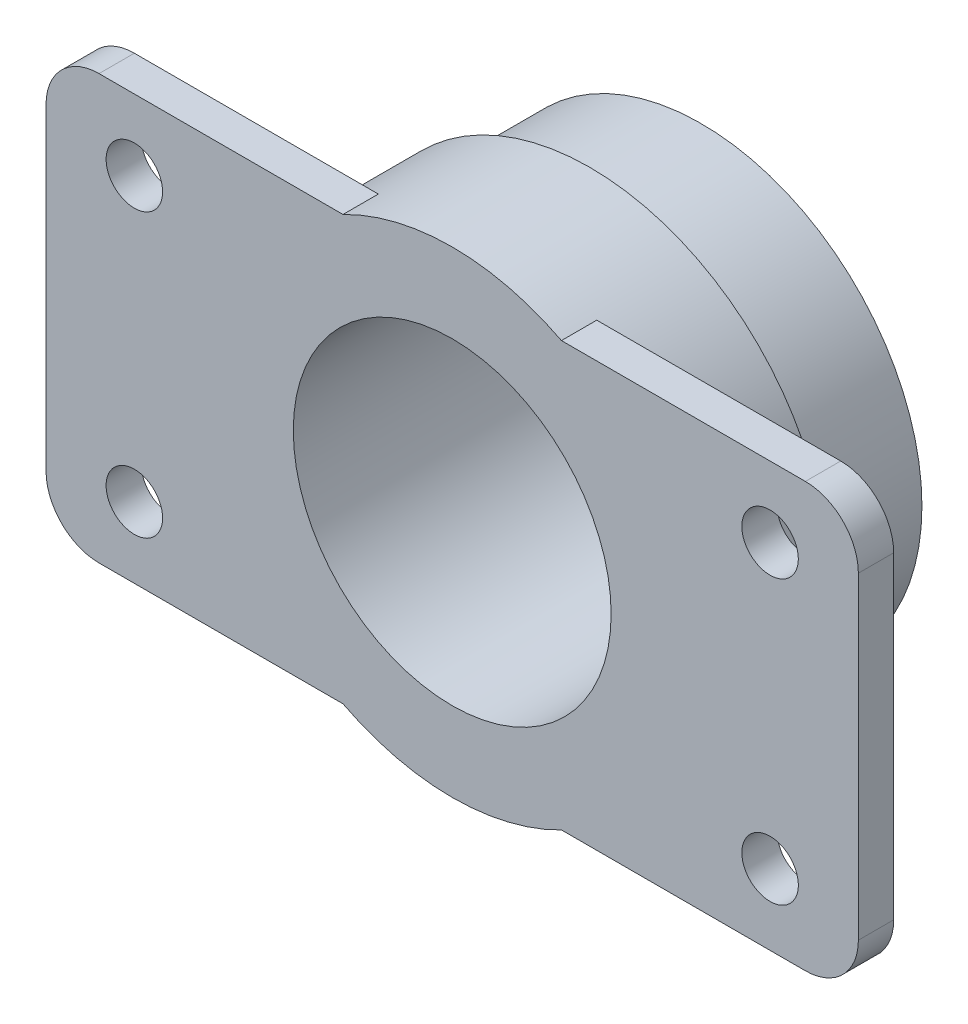
ISO-10303-21;
HEADER;
FILE_DESCRIPTION(('STEP AP214'),'2;1');
FILE_NAME('part.step','',(''),(''),'','','');
FILE_SCHEMA(('AUTOMOTIVE_DESIGN { 1 0 10303 214 1 1 1 1 }'));
ENDSEC;
DATA;
#1=APPLICATION_CONTEXT('core data for automotive mechanical design processes');
#2=APPLICATION_PROTOCOL_DEFINITION('international standard','automotive_design',2000,#1);
#3=PRODUCT_CONTEXT('',#1,'mechanical');
#4=PRODUCT('Part','Part','',(#3));
#5=PRODUCT_RELATED_PRODUCT_CATEGORY('part','',(#4));
#6=PRODUCT_DEFINITION_FORMATION('','',#4);
#7=PRODUCT_DEFINITION_CONTEXT('part definition',#1,'design');
#8=PRODUCT_DEFINITION('design','',#6,#7);
#9=PRODUCT_DEFINITION_SHAPE('','',#8);
#10=(LENGTH_UNIT() NAMED_UNIT(*) SI_UNIT(.MILLI.,.METRE.));
#11=(NAMED_UNIT(*) PLANE_ANGLE_UNIT() SI_UNIT($,.RADIAN.));
#12=(NAMED_UNIT(*) SI_UNIT($,.STERADIAN.) SOLID_ANGLE_UNIT());
#13=UNCERTAINTY_MEASURE_WITH_UNIT(LENGTH_MEASURE(1.E-05),#10,'distance_accuracy_value','');
#14=(GEOMETRIC_REPRESENTATION_CONTEXT(3) GLOBAL_UNCERTAINTY_ASSIGNED_CONTEXT((#13)) GLOBAL_UNIT_ASSIGNED_CONTEXT((#10,
#11,#12)) REPRESENTATION_CONTEXT('',''));
#15=CARTESIAN_POINT('',(0.,0.,0.));
#16=DIRECTION('',(0.,0.,1.));
#17=DIRECTION('',(1.,0.,0.));
#18=AXIS2_PLACEMENT_3D('',#15,#16,#17);
#19=CARTESIAN_POINT('',(23.,12.,14.1));
#20=DIRECTION('',(0.,-1.,0.));
#21=DIRECTION('',(1.,0.,0.));
#22=AXIS2_PLACEMENT_3D('',#19,#20,#21);
#23=PLANE('',#22);
#24=DIRECTION('',(0.,0.,-1.));
#25=VECTOR('',#24,1.);
#26=CARTESIAN_POINT('',(6.18465843842649,12.,26.5599357943771));
#27=LINE('',#26,#25);
#28=CARTESIAN_POINT('',(6.18465843842649,12.,14.1));
#29=VERTEX_POINT('',#28);
#30=CARTESIAN_POINT('',(6.18465843842649,12.,12.1));
#31=VERTEX_POINT('',#30);
#32=EDGE_CURVE('E67',#29,#31,#27,.T.);
#33=ORIENTED_EDGE('',*,*,#32,.F.);
#34=DIRECTION('',(-1.,0.,0.));
#35=VECTOR('',#34,1.);
#36=CARTESIAN_POINT('',(23.,12.,14.1));
#37=LINE('',#36,#35);
#38=CARTESIAN_POINT('',(20.,12.,14.1));
#39=VERTEX_POINT('',#38);
#40=EDGE_CURVE('E211',#39,#29,#37,.T.);
#41=ORIENTED_EDGE('',*,*,#40,.F.);
#42=DIRECTION('',(0.,0.,-1.));
#43=VECTOR('',#42,1.);
#44=CARTESIAN_POINT('',(20.,12.,14.1));
#45=LINE('',#44,#43);
#46=CARTESIAN_POINT('',(20.,12.,12.1));
#47=VERTEX_POINT('',#46);
#48=EDGE_CURVE('E53',#39,#47,#45,.T.);
#49=ORIENTED_EDGE('',*,*,#48,.T.);
#50=DIRECTION('',(-1.,0.,0.));
#51=VECTOR('',#50,1.);
#52=CARTESIAN_POINT('',(23.,12.,12.1));
#53=LINE('',#52,#51);
#54=EDGE_CURVE('E138',#47,#31,#53,.T.);
#55=ORIENTED_EDGE('',*,*,#54,.T.);
#56=EDGE_LOOP('',(#33,#41,#49,#55));
#57=FACE_BOUND('',#56,.T.);
#58=ADVANCED_FACE('F44',(#57),#23,.F.);
#59=CARTESIAN_POINT('',(-23.,-12.,14.1));
#60=DIRECTION('',(0.,1.,0.));
#61=DIRECTION('',(-1.,0.,0.));
#62=AXIS2_PLACEMENT_3D('',#59,#60,#61);
#63=PLANE('',#62);
#64=DIRECTION('',(0.,0.,-1.));
#65=VECTOR('',#64,1.);
#66=CARTESIAN_POINT('',(-6.18465843842649,-12.,26.5599357943771));
#67=LINE('',#66,#65);
#68=CARTESIAN_POINT('',(-6.18465843842649,-12.,14.1));
#69=VERTEX_POINT('',#68);
#70=CARTESIAN_POINT('',(-6.18465843842649,-12.,12.1));
#71=VERTEX_POINT('',#70);
#72=EDGE_CURVE('E167',#69,#71,#67,.T.);
#73=ORIENTED_EDGE('',*,*,#72,.F.);
#74=DIRECTION('',(1.,0.,0.));
#75=VECTOR('',#74,1.);
#76=CARTESIAN_POINT('',(-23.,-12.,14.1));
#77=LINE('',#76,#75);
#78=CARTESIAN_POINT('',(-20.,-12.,14.1));
#79=VERTEX_POINT('',#78);
#80=EDGE_CURVE('E225',#79,#69,#77,.T.);
#81=ORIENTED_EDGE('',*,*,#80,.F.);
#82=DIRECTION('',(0.,0.,-1.));
#83=VECTOR('',#82,1.);
#84=CARTESIAN_POINT('',(-20.,-12.,14.1));
#85=LINE('',#84,#83);
#86=CARTESIAN_POINT('',(-20.,-12.,12.1));
#87=VERTEX_POINT('',#86);
#88=EDGE_CURVE('E266',#79,#87,#85,.T.);
#89=ORIENTED_EDGE('',*,*,#88,.T.);
#90=DIRECTION('',(1.,0.,0.));
#91=VECTOR('',#90,1.);
#92=CARTESIAN_POINT('',(-23.,-12.,12.1));
#93=LINE('',#92,#91);
#94=EDGE_CURVE('E231',#87,#71,#93,.T.);
#95=ORIENTED_EDGE('',*,*,#94,.T.);
#96=EDGE_LOOP('',(#73,#81,#89,#95));
#97=FACE_BOUND('',#96,.T.);
#98=ADVANCED_FACE('F314',(#97),#63,.F.);
#99=CARTESIAN_POINT('',(0.,0.,0.));
#100=DIRECTION('',(0.,0.,1.));
#101=DIRECTION('',(1.,0.,0.));
#102=AXIS2_PLACEMENT_3D('',#99,#100,#101);
#103=PLANE('',#102);
#104=CARTESIAN_POINT('',(0.,0.,0.));
#105=DIRECTION('',(0.,0.,1.));
#106=DIRECTION('',(1.,0.,0.));
#107=AXIS2_PLACEMENT_3D('',#104,#105,#106);
#108=CIRCLE('',#107,12.5);
#109=CARTESIAN_POINT('',(12.5,0.,0.));
#110=VERTEX_POINT('',#109);
#111=EDGE_CURVE('E247',#110,#110,#108,.T.);
#112=ORIENTED_EDGE('',*,*,#111,.F.);
#113=EDGE_LOOP('',(#112));
#114=FACE_BOUND('',#113,.T.);
#115=CARTESIAN_POINT('',(0.,0.,0.));
#116=DIRECTION('',(0.,0.,1.));
#117=DIRECTION('',(1.,0.,0.));
#118=AXIS2_PLACEMENT_3D('',#115,#116,#117);
#119=CIRCLE('',#118,9.);
#120=CARTESIAN_POINT('',(9.,0.,0.));
#121=VERTEX_POINT('',#120);
#122=EDGE_CURVE('E242',#121,#121,#119,.T.);
#123=ORIENTED_EDGE('',*,*,#122,.T.);
#124=EDGE_LOOP('',(#123));
#125=FACE_BOUND('',#124,.T.);
#126=ADVANCED_FACE('F343',(#114,#125),#103,.F.);
#127=CARTESIAN_POINT('',(0.,0.,6.3));
#128=DIRECTION('',(0.,0.,-1.));
#129=DIRECTION('',(-1.,0.,0.));
#130=AXIS2_PLACEMENT_3D('',#127,#128,#129);
#131=CYLINDRICAL_SURFACE('',#130,12.5);
#132=CARTESIAN_POINT('',(0.,0.,6.3));
#133=DIRECTION('',(0.,0.,1.));
#134=DIRECTION('',(1.,0.,0.));
#135=AXIS2_PLACEMENT_3D('',#132,#133,#134);
#136=CIRCLE('',#135,12.5);
#137=CARTESIAN_POINT('',(12.5,0.,6.3));
#138=VERTEX_POINT('',#137);
#139=EDGE_CURVE('E248',#138,#138,#136,.T.);
#140=ORIENTED_EDGE('',*,*,#139,.F.);
#141=EDGE_LOOP('',(#140));
#142=FACE_BOUND('',#141,.T.);
#143=ORIENTED_EDGE('',*,*,#111,.T.);
#144=EDGE_LOOP('',(#143));
#145=FACE_BOUND('',#144,.T.);
#146=ADVANCED_FACE('F348',(#142,#145),#131,.T.);
#147=CARTESIAN_POINT('',(0.,0.,6.3));
#148=DIRECTION('',(0.,0.,-1.));
#149=DIRECTION('',(-1.,0.,0.));
#150=AXIS2_PLACEMENT_3D('',#147,#148,#149);
#151=CYLINDRICAL_SURFACE('',#150,9.);
#152=ORIENTED_EDGE('',*,*,#122,.F.);
#153=EDGE_LOOP('',(#152));
#154=FACE_BOUND('',#153,.T.);
#155=CARTESIAN_POINT('',(0.,0.,14.1));
#156=DIRECTION('',(0.,0.,1.));
#157=DIRECTION('',(1.,0.,0.));
#158=AXIS2_PLACEMENT_3D('',#155,#156,#157);
#159=CIRCLE('',#158,9.);
#160=CARTESIAN_POINT('',(9.,0.,14.1));
#161=VERTEX_POINT('',#160);
#162=EDGE_CURVE('E210',#161,#161,#159,.T.);
#163=ORIENTED_EDGE('',*,*,#162,.T.);
#164=EDGE_LOOP('',(#163));
#165=FACE_BOUND('',#164,.T.);
#166=ADVANCED_FACE('F539',(#154,#165),#151,.F.);
#167=CARTESIAN_POINT('',(0.,0.,6.3));
#168=DIRECTION('',(0.,0.,1.));
#169=DIRECTION('',(1.,0.,0.));
#170=AXIS2_PLACEMENT_3D('',#167,#168,#169);
#171=PLANE('',#170);
#172=ORIENTED_EDGE('',*,*,#139,.T.);
#173=EDGE_LOOP('',(#172));
#174=FACE_BOUND('',#173,.T.);
#175=CARTESIAN_POINT('',(0.,0.,6.3));
#176=DIRECTION('',(0.,0.,1.));
#177=DIRECTION('',(1.,0.,0.));
#178=AXIS2_PLACEMENT_3D('',#175,#176,#177);
#179=CIRCLE('',#178,13.5);
#180=CARTESIAN_POINT('',(13.5,0.,6.3));
#181=VERTEX_POINT('',#180);
#182=EDGE_CURVE('E147',#181,#181,#179,.T.);
#183=ORIENTED_EDGE('',*,*,#182,.F.);
#184=EDGE_LOOP('',(#183));
#185=FACE_BOUND('',#184,.T.);
#186=ADVANCED_FACE('F408',(#174,#185),#171,.F.);
#187=CARTESIAN_POINT('',(0.,0.,12.1));
#188=DIRECTION('',(0.,0.,-1.));
#189=DIRECTION('',(-1.,0.,0.));
#190=AXIS2_PLACEMENT_3D('',#187,#188,#189);
#191=CYLINDRICAL_SURFACE('',#190,13.5);
#192=CARTESIAN_POINT('',(0.,0.,12.1));
#193=DIRECTION('',(0.,0.,1.));
#194=DIRECTION('',(1.,0.,0.));
#195=AXIS2_PLACEMENT_3D('',#192,#193,#194);
#196=CIRCLE('',#195,13.5);
#197=CARTESIAN_POINT('',(-6.1846584384265,12.,12.1));
#198=VERTEX_POINT('',#197);
#199=EDGE_CURVE('E143',#198,#71,#196,.T.);
#200=ORIENTED_EDGE('',*,*,#199,.F.);
#201=DIRECTION('',(0.,0.,-1.));
#202=VECTOR('',#201,1.);
#203=CARTESIAN_POINT('',(-6.1846584384265,12.,26.5599357943771));
#204=LINE('',#203,#202);
#205=CARTESIAN_POINT('',(-6.1846584384265,12.,14.1));
#206=VERTEX_POINT('',#205);
#207=EDGE_CURVE('E163',#206,#198,#204,.T.);
#208=ORIENTED_EDGE('',*,*,#207,.F.);
#209=CARTESIAN_POINT('',(0.,0.,14.1));
#210=DIRECTION('',(0.,0.,1.));
#211=DIRECTION('',(1.,0.,0.));
#212=AXIS2_PLACEMENT_3D('',#209,#210,#211);
#213=CIRCLE('',#212,13.5);
#214=EDGE_CURVE('E156',#29,#206,#213,.T.);
#215=ORIENTED_EDGE('',*,*,#214,.F.);
#216=ORIENTED_EDGE('',*,*,#32,.T.);
#217=CARTESIAN_POINT('',(6.1846584384265,-12.,12.1));
#218=VERTEX_POINT('',#217);
#219=EDGE_CURVE('E140',#218,#31,#196,.T.);
#220=ORIENTED_EDGE('',*,*,#219,.F.);
#221=DIRECTION('',(0.,0.,-1.));
#222=VECTOR('',#221,1.);
#223=CARTESIAN_POINT('',(6.1846584384265,-12.,26.5599357943771));
#224=LINE('',#223,#222);
#225=CARTESIAN_POINT('',(6.18465843842649,-12.,14.1));
#226=VERTEX_POINT('',#225);
#227=EDGE_CURVE('E176',#226,#218,#224,.T.);
#228=ORIENTED_EDGE('',*,*,#227,.F.);
#229=CARTESIAN_POINT('',(0.,0.,14.1));
#230=DIRECTION('',(0.,0.,1.));
#231=DIRECTION('',(1.,0.,0.));
#232=AXIS2_PLACEMENT_3D('',#229,#230,#231);
#233=CIRCLE('',#232,13.5);
#234=EDGE_CURVE('E162',#69,#226,#233,.T.);
#235=ORIENTED_EDGE('',*,*,#234,.F.);
#236=ORIENTED_EDGE('',*,*,#72,.T.);
#237=EDGE_LOOP('',(#200,#208,#215,#216,#220,#228,#235,#236));
#238=FACE_BOUND('',#237,.T.);
#239=ORIENTED_EDGE('',*,*,#182,.T.);
#240=EDGE_LOOP('',(#239));
#241=FACE_BOUND('',#240,.T.);
#242=ADVANCED_FACE('F157',(#238,#241),#191,.T.);
#243=CARTESIAN_POINT('',(0.,0.,12.1));
#244=DIRECTION('',(0.,0.,1.));
#245=DIRECTION('',(1.,0.,0.));
#246=AXIS2_PLACEMENT_3D('',#243,#244,#245);
#247=PLANE('',#246);
#248=CARTESIAN_POINT('',(-18.,8.,12.1));
#249=DIRECTION('',(0.,0.,1.));
#250=DIRECTION('',(-1.,0.,0.));
#251=AXIS2_PLACEMENT_3D('',#248,#249,#250);
#252=CIRCLE('',#251,1.6);
#253=CARTESIAN_POINT('',(-19.6,8.,12.1));
#254=VERTEX_POINT('',#253);
#255=EDGE_CURVE('E183',#254,#254,#252,.T.);
#256=ORIENTED_EDGE('',*,*,#255,.T.);
#257=EDGE_LOOP('',(#256));
#258=FACE_BOUND('',#257,.T.);
#259=CARTESIAN_POINT('',(-18.,-8.00000000000001,12.1));
#260=DIRECTION('',(0.,0.,1.));
#261=DIRECTION('',(1.,0.,0.));
#262=AXIS2_PLACEMENT_3D('',#259,#260,#261);
#263=CIRCLE('',#262,1.6);
#264=CARTESIAN_POINT('',(-16.4,-8.00000000000001,12.1));
#265=VERTEX_POINT('',#264);
#266=EDGE_CURVE('E182',#265,#265,#263,.T.);
#267=ORIENTED_EDGE('',*,*,#266,.T.);
#268=EDGE_LOOP('',(#267));
#269=FACE_BOUND('',#268,.T.);
#270=ORIENTED_EDGE('',*,*,#94,.F.);
#271=CARTESIAN_POINT('',(-20.,-9.,12.1));
#272=DIRECTION('',(0.,0.,1.));
#273=DIRECTION('',(1.,0.,0.));
#274=AXIS2_PLACEMENT_3D('',#271,#272,#273);
#275=CIRCLE('',#274,3.);
#276=CARTESIAN_POINT('',(-23.,-9.,12.1));
#277=VERTEX_POINT('',#276);
#278=EDGE_CURVE('E292',#87,#277,#275,.F.);
#279=ORIENTED_EDGE('',*,*,#278,.T.);
#280=DIRECTION('',(0.,-1.,0.));
#281=VECTOR('',#280,1.);
#282=CARTESIAN_POINT('',(-23.,12.,12.1));
#283=LINE('',#282,#281);
#284=CARTESIAN_POINT('',(-23.,8.99999999999999,12.1));
#285=VERTEX_POINT('',#284);
#286=EDGE_CURVE('E151',#285,#277,#283,.T.);
#287=ORIENTED_EDGE('',*,*,#286,.F.);
#288=CARTESIAN_POINT('',(-20.,8.99999999999999,12.1));
#289=DIRECTION('',(0.,0.,1.));
#290=DIRECTION('',(1.,0.,0.));
#291=AXIS2_PLACEMENT_3D('',#288,#289,#290);
#292=CIRCLE('',#291,3.);
#293=CARTESIAN_POINT('',(-20.,12.,12.1));
#294=VERTEX_POINT('',#293);
#295=EDGE_CURVE('E286',#285,#294,#292,.F.);
#296=ORIENTED_EDGE('',*,*,#295,.T.);
#297=EDGE_CURVE('E155',#198,#294,#53,.T.);
#298=ORIENTED_EDGE('',*,*,#297,.F.);
#299=ORIENTED_EDGE('',*,*,#199,.T.);
#300=EDGE_LOOP('',(#270,#279,#287,#296,#298,#299));
#301=FACE_BOUND('',#300,.T.);
#302=ADVANCED_FACE('F311',(#258,#269,#301),#247,.F.);
#303=CARTESIAN_POINT('',(18.,-8.,12.1));
#304=DIRECTION('',(0.,0.,1.));
#305=DIRECTION('',(-1.,0.,0.));
#306=AXIS2_PLACEMENT_3D('',#303,#304,#305);
#307=CIRCLE('',#306,1.6);
#308=CARTESIAN_POINT('',(16.4,-8.,12.1));
#309=VERTEX_POINT('',#308);
#310=EDGE_CURVE('E195',#309,#309,#307,.T.);
#311=ORIENTED_EDGE('',*,*,#310,.T.);
#312=EDGE_LOOP('',(#311));
#313=FACE_BOUND('',#312,.T.);
#314=CARTESIAN_POINT('',(18.,8.00000000000001,12.1));
#315=DIRECTION('',(0.,0.,1.));
#316=DIRECTION('',(1.,0.,0.));
#317=AXIS2_PLACEMENT_3D('',#314,#315,#316);
#318=CIRCLE('',#317,1.6);
#319=CARTESIAN_POINT('',(19.6,8.00000000000001,12.1));
#320=VERTEX_POINT('',#319);
#321=EDGE_CURVE('E199',#320,#320,#318,.T.);
#322=ORIENTED_EDGE('',*,*,#321,.T.);
#323=EDGE_LOOP('',(#322));
#324=FACE_BOUND('',#323,.T.);
#325=DIRECTION('',(0.,1.,0.));
#326=VECTOR('',#325,1.);
#327=CARTESIAN_POINT('',(23.,-12.,12.1));
#328=LINE('',#327,#326);
#329=CARTESIAN_POINT('',(23.,-9.,12.1));
#330=VERTEX_POINT('',#329);
#331=CARTESIAN_POINT('',(23.,9.,12.1));
#332=VERTEX_POINT('',#331);
#333=EDGE_CURVE('E240',#330,#332,#328,.T.);
#334=ORIENTED_EDGE('',*,*,#333,.F.);
#335=CARTESIAN_POINT('',(20.,-9.,12.1));
#336=DIRECTION('',(0.,0.,1.));
#337=DIRECTION('',(1.,0.,0.));
#338=AXIS2_PLACEMENT_3D('',#335,#336,#337);
#339=CIRCLE('',#338,3.);
#340=CARTESIAN_POINT('',(20.,-12.,12.1));
#341=VERTEX_POINT('',#340);
#342=EDGE_CURVE('E267',#330,#341,#339,.F.);
#343=ORIENTED_EDGE('',*,*,#342,.T.);
#344=EDGE_CURVE('E145',#218,#341,#93,.T.);
#345=ORIENTED_EDGE('',*,*,#344,.F.);
#346=ORIENTED_EDGE('',*,*,#219,.T.);
#347=ORIENTED_EDGE('',*,*,#54,.F.);
#348=CARTESIAN_POINT('',(20.,9.,12.1));
#349=DIRECTION('',(0.,0.,1.));
#350=DIRECTION('',(1.,0.,0.));
#351=AXIS2_PLACEMENT_3D('',#348,#349,#350);
#352=CIRCLE('',#351,3.);
#353=EDGE_CURVE('E262',#47,#332,#352,.F.);
#354=ORIENTED_EDGE('',*,*,#353,.T.);
#355=EDGE_LOOP('',(#334,#343,#345,#346,#347,#354));
#356=FACE_BOUND('',#355,.T.);
#357=ADVANCED_FACE('F136',(#313,#324,#356),#247,.F.);
#358=CARTESIAN_POINT('',(0.,0.,14.1));
#359=DIRECTION('',(0.,0.,1.));
#360=DIRECTION('',(1.,0.,0.));
#361=AXIS2_PLACEMENT_3D('',#358,#359,#360);
#362=PLANE('',#361);
#363=CARTESIAN_POINT('',(-18.,-8.00000000000001,14.1));
#364=DIRECTION('',(0.,0.,1.));
#365=DIRECTION('',(1.,0.,0.));
#366=AXIS2_PLACEMENT_3D('',#363,#364,#365);
#367=CIRCLE('',#366,1.6);
#368=CARTESIAN_POINT('',(-16.4,-8.00000000000001,14.1));
#369=VERTEX_POINT('',#368);
#370=EDGE_CURVE('E189',#369,#369,#367,.T.);
#371=ORIENTED_EDGE('',*,*,#370,.F.);
#372=EDGE_LOOP('',(#371));
#373=FACE_BOUND('',#372,.T.);
#374=CARTESIAN_POINT('',(18.,8.00000000000001,14.1));
#375=DIRECTION('',(0.,0.,1.));
#376=DIRECTION('',(1.,0.,0.));
#377=AXIS2_PLACEMENT_3D('',#374,#375,#376);
#378=CIRCLE('',#377,1.6);
#379=CARTESIAN_POINT('',(19.6,8.00000000000001,14.1));
#380=VERTEX_POINT('',#379);
#381=EDGE_CURVE('E201',#380,#380,#378,.T.);
#382=ORIENTED_EDGE('',*,*,#381,.F.);
#383=EDGE_LOOP('',(#382));
#384=FACE_BOUND('',#383,.T.);
#385=ORIENTED_EDGE('',*,*,#80,.T.);
#386=ORIENTED_EDGE('',*,*,#234,.T.);
#387=CARTESIAN_POINT('',(20.,-12.,14.1));
#388=VERTEX_POINT('',#387);
#389=EDGE_CURVE('E222',#226,#388,#77,.T.);
#390=ORIENTED_EDGE('',*,*,#389,.T.);
#391=CARTESIAN_POINT('',(20.,-9.,14.1));
#392=DIRECTION('',(0.,0.,1.));
#393=DIRECTION('',(1.,0.,0.));
#394=AXIS2_PLACEMENT_3D('',#391,#392,#393);
#395=CIRCLE('',#394,3.);
#396=CARTESIAN_POINT('',(23.,-9.,14.1));
#397=VERTEX_POINT('',#396);
#398=EDGE_CURVE('E287',#388,#397,#395,.T.);
#399=ORIENTED_EDGE('',*,*,#398,.T.);
#400=DIRECTION('',(0.,1.,0.));
#401=VECTOR('',#400,1.);
#402=CARTESIAN_POINT('',(23.,-12.,14.1));
#403=LINE('',#402,#401);
#404=CARTESIAN_POINT('',(23.,9.,14.1));
#405=VERTEX_POINT('',#404);
#406=EDGE_CURVE('E228',#397,#405,#403,.T.);
#407=ORIENTED_EDGE('',*,*,#406,.T.);
#408=CARTESIAN_POINT('',(20.,9.,14.1));
#409=DIRECTION('',(0.,0.,1.));
#410=DIRECTION('',(1.,0.,0.));
#411=AXIS2_PLACEMENT_3D('',#408,#409,#410);
#412=CIRCLE('',#411,3.);
#413=EDGE_CURVE('E280',#405,#39,#412,.T.);
#414=ORIENTED_EDGE('',*,*,#413,.T.);
#415=ORIENTED_EDGE('',*,*,#40,.T.);
#416=ORIENTED_EDGE('',*,*,#214,.T.);
#417=CARTESIAN_POINT('',(-20.,12.,14.1));
#418=VERTEX_POINT('',#417);
#419=EDGE_CURVE('E58',#206,#418,#37,.T.);
#420=ORIENTED_EDGE('',*,*,#419,.T.);
#421=CARTESIAN_POINT('',(-20.,8.99999999999999,14.1));
#422=DIRECTION('',(0.,0.,1.));
#423=DIRECTION('',(1.,0.,0.));
#424=AXIS2_PLACEMENT_3D('',#421,#422,#423);
#425=CIRCLE('',#424,3.);
#426=CARTESIAN_POINT('',(-23.,8.99999999999999,14.1));
#427=VERTEX_POINT('',#426);
#428=EDGE_CURVE('E278',#418,#427,#425,.T.);
#429=ORIENTED_EDGE('',*,*,#428,.T.);
#430=DIRECTION('',(0.,-1.,0.));
#431=VECTOR('',#430,1.);
#432=CARTESIAN_POINT('',(-23.,12.,14.1));
#433=LINE('',#432,#431);
#434=CARTESIAN_POINT('',(-23.,-9.,14.1));
#435=VERTEX_POINT('',#434);
#436=EDGE_CURVE('E220',#427,#435,#433,.T.);
#437=ORIENTED_EDGE('',*,*,#436,.T.);
#438=CARTESIAN_POINT('',(-20.,-9.,14.1));
#439=DIRECTION('',(0.,0.,1.));
#440=DIRECTION('',(1.,0.,0.));
#441=AXIS2_PLACEMENT_3D('',#438,#439,#440);
#442=CIRCLE('',#441,3.);
#443=EDGE_CURVE('E282',#435,#79,#442,.T.);
#444=ORIENTED_EDGE('',*,*,#443,.T.);
#445=EDGE_LOOP('',(#385,#386,#390,#399,#407,#414,#415,#416,#420,#429,#437,#444));
#446=FACE_BOUND('',#445,.T.);
#447=ORIENTED_EDGE('',*,*,#162,.F.);
#448=EDGE_LOOP('',(#447));
#449=FACE_BOUND('',#448,.T.);
#450=CARTESIAN_POINT('',(18.,-8.,14.1));
#451=DIRECTION('',(0.,0.,1.));
#452=DIRECTION('',(-1.,0.,0.));
#453=AXIS2_PLACEMENT_3D('',#450,#451,#452);
#454=CIRCLE('',#453,1.6);
#455=CARTESIAN_POINT('',(16.4,-8.,14.1));
#456=VERTEX_POINT('',#455);
#457=EDGE_CURVE('E196',#456,#456,#454,.T.);
#458=ORIENTED_EDGE('',*,*,#457,.F.);
#459=EDGE_LOOP('',(#458));
#460=FACE_BOUND('',#459,.T.);
#461=CARTESIAN_POINT('',(-18.,8.,14.1));
#462=DIRECTION('',(0.,0.,1.));
#463=DIRECTION('',(-1.,0.,0.));
#464=AXIS2_PLACEMENT_3D('',#461,#462,#463);
#465=CIRCLE('',#464,1.6);
#466=CARTESIAN_POINT('',(-19.6,8.,14.1));
#467=VERTEX_POINT('',#466);
#468=EDGE_CURVE('E177',#467,#467,#465,.T.);
#469=ORIENTED_EDGE('',*,*,#468,.F.);
#470=EDGE_LOOP('',(#469));
#471=FACE_BOUND('',#470,.T.);
#472=ADVANCED_FACE('F335',(#373,#384,#446,#449,#460,#471),#362,.T.);
#473=ORIENTED_EDGE('',*,*,#419,.F.);
#474=ORIENTED_EDGE('',*,*,#207,.T.);
#475=ORIENTED_EDGE('',*,*,#297,.T.);
#476=DIRECTION('',(0.,0.,-1.));
#477=VECTOR('',#476,1.);
#478=CARTESIAN_POINT('',(-20.,12.,14.1));
#479=LINE('',#478,#477);
#480=EDGE_CURVE('E11',#294,#418,#479,.F.);
#481=ORIENTED_EDGE('',*,*,#480,.T.);
#482=EDGE_LOOP('',(#473,#474,#475,#481));
#483=FACE_BOUND('',#482,.T.);
#484=ADVANCED_FACE('F329',(#483),#23,.F.);
#485=CARTESIAN_POINT('',(-23.,12.,14.1));
#486=DIRECTION('',(1.,0.,0.));
#487=DIRECTION('',(0.,1.,0.));
#488=AXIS2_PLACEMENT_3D('',#485,#486,#487);
#489=PLANE('',#488);
#490=ORIENTED_EDGE('',*,*,#286,.T.);
#491=DIRECTION('',(0.,0.,-1.));
#492=VECTOR('',#491,1.);
#493=CARTESIAN_POINT('',(-23.,-9.,14.1));
#494=LINE('',#493,#492);
#495=EDGE_CURVE('E299',#277,#435,#494,.F.);
#496=ORIENTED_EDGE('',*,*,#495,.T.);
#497=ORIENTED_EDGE('',*,*,#436,.F.);
#498=DIRECTION('',(0.,0.,-1.));
#499=VECTOR('',#498,1.);
#500=CARTESIAN_POINT('',(-23.,8.99999999999999,14.1));
#501=LINE('',#500,#499);
#502=EDGE_CURVE('E294',#427,#285,#501,.T.);
#503=ORIENTED_EDGE('',*,*,#502,.T.);
#504=EDGE_LOOP('',(#490,#496,#497,#503));
#505=FACE_BOUND('',#504,.T.);
#506=ADVANCED_FACE('F324',(#505),#489,.F.);
#507=ORIENTED_EDGE('',*,*,#389,.F.);
#508=ORIENTED_EDGE('',*,*,#227,.T.);
#509=ORIENTED_EDGE('',*,*,#344,.T.);
#510=DIRECTION('',(0.,0.,-1.));
#511=VECTOR('',#510,1.);
#512=CARTESIAN_POINT('',(20.,-12.,14.1));
#513=LINE('',#512,#511);
#514=EDGE_CURVE('E271',#341,#388,#513,.F.);
#515=ORIENTED_EDGE('',*,*,#514,.T.);
#516=EDGE_LOOP('',(#507,#508,#509,#515));
#517=FACE_BOUND('',#516,.T.);
#518=ADVANCED_FACE('F340',(#517),#63,.F.);
#519=CARTESIAN_POINT('',(23.,-12.,14.1));
#520=DIRECTION('',(-1.,0.,0.));
#521=DIRECTION('',(0.,-1.,0.));
#522=AXIS2_PLACEMENT_3D('',#519,#520,#521);
#523=PLANE('',#522);
#524=ORIENTED_EDGE('',*,*,#406,.F.);
#525=DIRECTION('',(0.,0.,-1.));
#526=VECTOR('',#525,1.);
#527=CARTESIAN_POINT('',(23.,-9.,14.1));
#528=LINE('',#527,#526);
#529=EDGE_CURVE('E256',#397,#330,#528,.T.);
#530=ORIENTED_EDGE('',*,*,#529,.T.);
#531=ORIENTED_EDGE('',*,*,#333,.T.);
#532=DIRECTION('',(0.,0.,-1.));
#533=VECTOR('',#532,1.);
#534=CARTESIAN_POINT('',(23.,9.,14.1));
#535=LINE('',#534,#533);
#536=EDGE_CURVE('E254',#332,#405,#535,.F.);
#537=ORIENTED_EDGE('',*,*,#536,.T.);
#538=EDGE_LOOP('',(#524,#530,#531,#537));
#539=FACE_BOUND('',#538,.T.);
#540=ADVANCED_FACE('F351',(#539),#523,.F.);
#541=CARTESIAN_POINT('',(18.,8.00000000000001,14.1));
#542=DIRECTION('',(0.,0.,-1.));
#543=DIRECTION('',(-1.,0.,0.));
#544=AXIS2_PLACEMENT_3D('',#541,#542,#543);
#545=CYLINDRICAL_SURFACE('',#544,1.6);
#546=ORIENTED_EDGE('',*,*,#381,.T.);
#547=EDGE_LOOP('',(#546));
#548=FACE_BOUND('',#547,.T.);
#549=ORIENTED_EDGE('',*,*,#321,.F.);
#550=EDGE_LOOP('',(#549));
#551=FACE_BOUND('',#550,.T.);
#552=ADVANCED_FACE('F356',(#548,#551),#545,.F.);
#553=CARTESIAN_POINT('',(18.,-8.,14.1));
#554=DIRECTION('',(0.,0.,-1.));
#555=DIRECTION('',(-1.,0.,0.));
#556=AXIS2_PLACEMENT_3D('',#553,#554,#555);
#557=CYLINDRICAL_SURFACE('',#556,1.6);
#558=ORIENTED_EDGE('',*,*,#457,.T.);
#559=EDGE_LOOP('',(#558));
#560=FACE_BOUND('',#559,.T.);
#561=ORIENTED_EDGE('',*,*,#310,.F.);
#562=EDGE_LOOP('',(#561));
#563=FACE_BOUND('',#562,.T.);
#564=ADVANCED_FACE('F468',(#560,#563),#557,.F.);
#565=CARTESIAN_POINT('',(-18.,-8.00000000000001,14.1));
#566=DIRECTION('',(0.,0.,-1.));
#567=DIRECTION('',(-1.,0.,0.));
#568=AXIS2_PLACEMENT_3D('',#565,#566,#567);
#569=CYLINDRICAL_SURFACE('',#568,1.6);
#570=ORIENTED_EDGE('',*,*,#370,.T.);
#571=EDGE_LOOP('',(#570));
#572=FACE_BOUND('',#571,.T.);
#573=ORIENTED_EDGE('',*,*,#266,.F.);
#574=EDGE_LOOP('',(#573));
#575=FACE_BOUND('',#574,.T.);
#576=ADVANCED_FACE('F379',(#572,#575),#569,.F.);
#577=CARTESIAN_POINT('',(-18.,8.,14.1));
#578=DIRECTION('',(0.,0.,-1.));
#579=DIRECTION('',(-1.,0.,0.));
#580=AXIS2_PLACEMENT_3D('',#577,#578,#579);
#581=CYLINDRICAL_SURFACE('',#580,1.6);
#582=ORIENTED_EDGE('',*,*,#468,.T.);
#583=EDGE_LOOP('',(#582));
#584=FACE_BOUND('',#583,.T.);
#585=ORIENTED_EDGE('',*,*,#255,.F.);
#586=EDGE_LOOP('',(#585));
#587=FACE_BOUND('',#586,.T.);
#588=ADVANCED_FACE('F372',(#584,#587),#581,.F.);
#589=CARTESIAN_POINT('',(20.,-9.,14.1));
#590=DIRECTION('',(0.,0.,-1.));
#591=DIRECTION('',(-1.,0.,0.));
#592=AXIS2_PLACEMENT_3D('',#589,#590,#591);
#593=CYLINDRICAL_SURFACE('',#592,3.);
#594=ORIENTED_EDGE('',*,*,#398,.F.);
#595=ORIENTED_EDGE('',*,*,#514,.F.);
#596=ORIENTED_EDGE('',*,*,#342,.F.);
#597=ORIENTED_EDGE('',*,*,#529,.F.);
#598=EDGE_LOOP('',(#594,#595,#596,#597));
#599=FACE_BOUND('',#598,.T.);
#600=ADVANCED_FACE('F375',(#599),#593,.T.);
#601=CARTESIAN_POINT('',(-20.,-9.,14.1));
#602=DIRECTION('',(0.,0.,-1.));
#603=DIRECTION('',(-1.,0.,0.));
#604=AXIS2_PLACEMENT_3D('',#601,#602,#603);
#605=CYLINDRICAL_SURFACE('',#604,3.);
#606=ORIENTED_EDGE('',*,*,#443,.F.);
#607=ORIENTED_EDGE('',*,*,#495,.F.);
#608=ORIENTED_EDGE('',*,*,#278,.F.);
#609=ORIENTED_EDGE('',*,*,#88,.F.);
#610=EDGE_LOOP('',(#606,#607,#608,#609));
#611=FACE_BOUND('',#610,.T.);
#612=ADVANCED_FACE('F316',(#611),#605,.T.);
#613=CARTESIAN_POINT('',(-20.,8.99999999999999,14.1));
#614=DIRECTION('',(0.,0.,-1.));
#615=DIRECTION('',(-1.,0.,0.));
#616=AXIS2_PLACEMENT_3D('',#613,#614,#615);
#617=CYLINDRICAL_SURFACE('',#616,3.);
#618=ORIENTED_EDGE('',*,*,#428,.F.);
#619=ORIENTED_EDGE('',*,*,#480,.F.);
#620=ORIENTED_EDGE('',*,*,#295,.F.);
#621=ORIENTED_EDGE('',*,*,#502,.F.);
#622=EDGE_LOOP('',(#618,#619,#620,#621));
#623=FACE_BOUND('',#622,.T.);
#624=ADVANCED_FACE('F327',(#623),#617,.T.);
#625=CARTESIAN_POINT('',(20.,9.,14.1));
#626=DIRECTION('',(0.,0.,-1.));
#627=DIRECTION('',(-1.,0.,0.));
#628=AXIS2_PLACEMENT_3D('',#625,#626,#627);
#629=CYLINDRICAL_SURFACE('',#628,3.);
#630=ORIENTED_EDGE('',*,*,#413,.F.);
#631=ORIENTED_EDGE('',*,*,#536,.F.);
#632=ORIENTED_EDGE('',*,*,#353,.F.);
#633=ORIENTED_EDGE('',*,*,#48,.F.);
#634=EDGE_LOOP('',(#630,#631,#632,#633));
#635=FACE_BOUND('',#634,.T.);
#636=ADVANCED_FACE('F50',(#635),#629,.T.);
#637=CLOSED_SHELL('',(#58,#98,#126,#146,#166,#186,#242,#302,#357,#472,#484,#506,#518,#540,#552,
#564,#576,#588,#600,#612,#624,#636));
#638=MANIFOLD_SOLID_BREP('B2',#637);
#639=ADVANCED_BREP_SHAPE_REPRESENTATION('',(#18,#638),#14);
#640=SHAPE_DEFINITION_REPRESENTATION(#9,#639);
ENDSEC;
END-ISO-10303-21;
